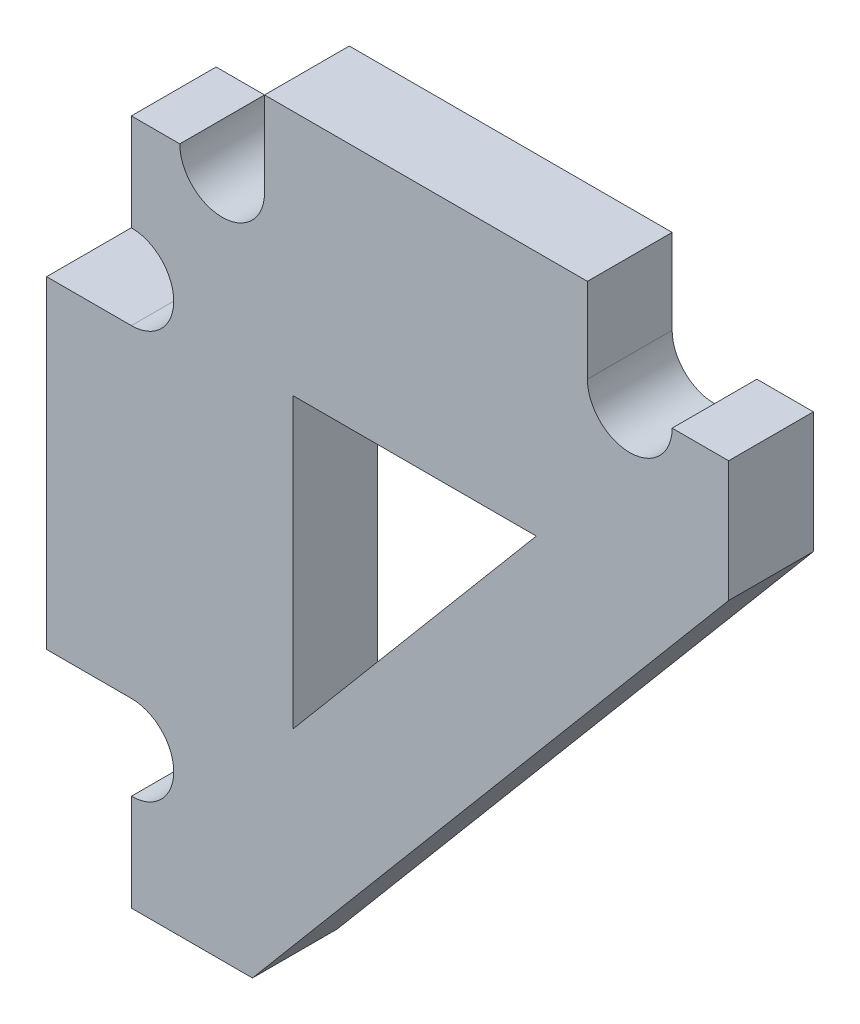
ISO-10303-21;
HEADER;
FILE_DESCRIPTION(('STEP AP214'),'2;1');
FILE_NAME('part.step','',(''),(''),'','','');
FILE_SCHEMA(('AUTOMOTIVE_DESIGN { 1 0 10303 214 1 1 1 1 }'));
ENDSEC;
DATA;
#1=APPLICATION_CONTEXT('core data for automotive mechanical design processes');
#2=APPLICATION_PROTOCOL_DEFINITION('international standard','automotive_design',2000,#1);
#3=PRODUCT_CONTEXT('',#1,'mechanical');
#4=PRODUCT('Part','Part','',(#3));
#5=PRODUCT_RELATED_PRODUCT_CATEGORY('part','',(#4));
#6=PRODUCT_DEFINITION_FORMATION('','',#4);
#7=PRODUCT_DEFINITION_CONTEXT('part definition',#1,'design');
#8=PRODUCT_DEFINITION('design','',#6,#7);
#9=PRODUCT_DEFINITION_SHAPE('','',#8);
#10=(LENGTH_UNIT() NAMED_UNIT(*) SI_UNIT(.MILLI.,.METRE.));
#11=(NAMED_UNIT(*) PLANE_ANGLE_UNIT() SI_UNIT($,.RADIAN.));
#12=(NAMED_UNIT(*) SI_UNIT($,.STERADIAN.) SOLID_ANGLE_UNIT());
#13=UNCERTAINTY_MEASURE_WITH_UNIT(LENGTH_MEASURE(1.E-05),#10,'distance_accuracy_value','');
#14=(GEOMETRIC_REPRESENTATION_CONTEXT(3) GLOBAL_UNCERTAINTY_ASSIGNED_CONTEXT((#13)) GLOBAL_UNIT_ASSIGNED_CONTEXT((#10,
#11,#12)) REPRESENTATION_CONTEXT('',''));
#15=CARTESIAN_POINT('',(0.,0.,0.));
#16=DIRECTION('',(0.,0.,1.));
#17=DIRECTION('',(1.,0.,0.));
#18=AXIS2_PLACEMENT_3D('',#15,#16,#17);
#19=CARTESIAN_POINT('',(0.,-4.,2.1));
#20=DIRECTION('',(0.,-1.,0.));
#21=DIRECTION('',(1.,0.,0.));
#22=AXIS2_PLACEMENT_3D('',#19,#20,#21);
#23=PLANE('',#22);
#24=DIRECTION('',(-1.,0.,0.));
#25=VECTOR('',#24,1.);
#26=CARTESIAN_POINT('',(0.,-4.,0.));
#27=LINE('',#26,#25);
#28=CARTESIAN_POINT('',(10.0336656405163,-4.,0.));
#29=VERTEX_POINT('',#28);
#30=CARTESIAN_POINT('',(4.,-4.,0.));
#31=VERTEX_POINT('',#30);
#32=EDGE_CURVE('E179',#29,#31,#27,.T.);
#33=ORIENTED_EDGE('',*,*,#32,.F.);
#34=DIRECTION('',(0.,0.,-1.));
#35=VECTOR('',#34,1.);
#36=CARTESIAN_POINT('',(10.0336656405163,-4.,2.1));
#37=LINE('',#36,#35);
#38=CARTESIAN_POINT('',(10.0336656405163,-4.,2.1));
#39=VERTEX_POINT('',#38);
#40=EDGE_CURVE('E11',#39,#29,#37,.T.);
#41=ORIENTED_EDGE('',*,*,#40,.F.);
#42=DIRECTION('',(-1.,0.,0.));
#43=VECTOR('',#42,1.);
#44=CARTESIAN_POINT('',(0.,-4.,2.1));
#45=LINE('',#44,#43);
#46=CARTESIAN_POINT('',(4.,-4.,2.1));
#47=VERTEX_POINT('',#46);
#48=EDGE_CURVE('E177',#39,#47,#45,.T.);
#49=ORIENTED_EDGE('',*,*,#48,.T.);
#50=DIRECTION('',(0.,0.,-1.));
#51=VECTOR('',#50,1.);
#52=CARTESIAN_POINT('',(4.,-4.,2.1));
#53=LINE('',#52,#51);
#54=EDGE_CURVE('E55',#47,#31,#53,.T.);
#55=ORIENTED_EDGE('',*,*,#54,.T.);
#56=EDGE_LOOP('',(#33,#41,#49,#55));
#57=FACE_BOUND('',#56,.T.);
#58=ADVANCED_FACE('F36',(#57),#23,.T.);
#59=CARTESIAN_POINT('',(7.83736566501967,-6.60577963194515,2.1));
#60=DIRECTION('',(-0.764627863081978,0.644472056026239,0.));
#61=DIRECTION('',(-0.644472056026239,-0.764627863081978,0.));
#62=AXIS2_PLACEMENT_3D('',#59,#60,#61);
#63=PLANE('',#62);
#64=DIRECTION('',(0.644472056026239,0.764627863081978,0.));
#65=VECTOR('',#64,1.);
#66=CARTESIAN_POINT('',(7.83736566501967,-6.60577963194515,0.));
#67=LINE('',#66,#65);
#68=CARTESIAN_POINT('',(4.,-11.1585863531549,0.));
#69=VERTEX_POINT('',#68);
#70=EDGE_CURVE('E239',#69,#29,#67,.T.);
#71=ORIENTED_EDGE('',*,*,#70,.F.);
#72=DIRECTION('',(0.,0.,-1.));
#73=VECTOR('',#72,1.);
#74=CARTESIAN_POINT('',(4.,-11.1585863531549,2.1));
#75=LINE('',#74,#73);
#76=CARTESIAN_POINT('',(4.,-11.1585863531549,2.1));
#77=VERTEX_POINT('',#76);
#78=EDGE_CURVE('E46',#77,#69,#75,.T.);
#79=ORIENTED_EDGE('',*,*,#78,.F.);
#80=DIRECTION('',(0.644472056026239,0.764627863081978,0.));
#81=VECTOR('',#80,1.);
#82=CARTESIAN_POINT('',(7.83736566501967,-6.60577963194515,2.1));
#83=LINE('',#82,#81);
#84=EDGE_CURVE('E186',#77,#39,#83,.T.);
#85=ORIENTED_EDGE('',*,*,#84,.T.);
#86=ORIENTED_EDGE('',*,*,#40,.T.);
#87=EDGE_LOOP('',(#71,#79,#85,#86));
#88=FACE_BOUND('',#87,.T.);
#89=ADVANCED_FACE('F190',(#88),#63,.T.);
#90=CARTESIAN_POINT('',(0.,-3.45,2.1));
#91=DIRECTION('',(0.,0.,-1.));
#92=DIRECTION('',(-1.,0.,0.));
#93=AXIS2_PLACEMENT_3D('',#90,#91,#92);
#94=CYLINDRICAL_SURFACE('',#93,1.05);
#95=CARTESIAN_POINT('',(0.,-3.45,0.));
#96=DIRECTION('',(0.,0.,1.));
#97=DIRECTION('',(1.,0.,0.));
#98=AXIS2_PLACEMENT_3D('',#95,#96,#97);
#99=CIRCLE('',#98,1.05);
#100=CARTESIAN_POINT('',(0.,-4.5,0.));
#101=VERTEX_POINT('',#100);
#102=CARTESIAN_POINT('',(0.,-2.4,0.));
#103=VERTEX_POINT('',#102);
#104=EDGE_CURVE('E196',#101,#103,#99,.T.);
#105=ORIENTED_EDGE('',*,*,#104,.F.);
#106=DIRECTION('',(0.,0.,-1.));
#107=VECTOR('',#106,1.);
#108=CARTESIAN_POINT('',(0.,-4.5,2.1));
#109=LINE('',#108,#107);
#110=CARTESIAN_POINT('',(0.,-4.5,2.1));
#111=VERTEX_POINT('',#110);
#112=EDGE_CURVE('E40',#111,#101,#109,.T.);
#113=ORIENTED_EDGE('',*,*,#112,.F.);
#114=CARTESIAN_POINT('',(0.,-3.45,2.1));
#115=DIRECTION('',(0.,0.,1.));
#116=DIRECTION('',(1.,0.,0.));
#117=AXIS2_PLACEMENT_3D('',#114,#115,#116);
#118=CIRCLE('',#117,1.05);
#119=CARTESIAN_POINT('',(0.,-2.4,2.1));
#120=VERTEX_POINT('',#119);
#121=EDGE_CURVE('E244',#111,#120,#118,.T.);
#122=ORIENTED_EDGE('',*,*,#121,.T.);
#123=DIRECTION('',(0.,0.,-1.));
#124=VECTOR('',#123,1.);
#125=CARTESIAN_POINT('',(0.,-2.4,2.1));
#126=LINE('',#125,#124);
#127=EDGE_CURVE('E192',#120,#103,#126,.T.);
#128=ORIENTED_EDGE('',*,*,#127,.T.);
#129=EDGE_LOOP('',(#105,#113,#122,#128));
#130=FACE_BOUND('',#129,.T.);
#131=ADVANCED_FACE('F38',(#130),#94,.F.);
#132=CARTESIAN_POINT('',(0.,-4.5,2.1));
#133=DIRECTION('',(0.,-1.,0.));
#134=DIRECTION('',(1.,0.,0.));
#135=AXIS2_PLACEMENT_3D('',#132,#133,#134);
#136=PLANE('',#135);
#137=DIRECTION('',(-1.,0.,0.));
#138=VECTOR('',#137,1.);
#139=CARTESIAN_POINT('',(0.,-4.5,0.));
#140=LINE('',#139,#138);
#141=CARTESIAN_POINT('',(-2.1,-4.5,0.));
#142=VERTEX_POINT('',#141);
#143=EDGE_CURVE('E199',#101,#142,#140,.T.);
#144=ORIENTED_EDGE('',*,*,#143,.T.);
#145=DIRECTION('',(0.,0.,-1.));
#146=VECTOR('',#145,1.);
#147=CARTESIAN_POINT('',(-2.1,-4.5,2.1));
#148=LINE('',#147,#146);
#149=CARTESIAN_POINT('',(-2.1,-4.5,2.1));
#150=VERTEX_POINT('',#149);
#151=EDGE_CURVE('E283',#150,#142,#148,.T.);
#152=ORIENTED_EDGE('',*,*,#151,.F.);
#153=DIRECTION('',(-1.,0.,0.));
#154=VECTOR('',#153,1.);
#155=CARTESIAN_POINT('',(0.,-4.5,2.1));
#156=LINE('',#155,#154);
#157=EDGE_CURVE('E292',#111,#150,#156,.T.);
#158=ORIENTED_EDGE('',*,*,#157,.F.);
#159=ORIENTED_EDGE('',*,*,#112,.T.);
#160=EDGE_LOOP('',(#144,#152,#158,#159));
#161=FACE_BOUND('',#160,.T.);
#162=ADVANCED_FACE('F291',(#161),#136,.F.);
#163=CARTESIAN_POINT('',(-2.1,0.,2.1));
#164=DIRECTION('',(1.,0.,0.));
#165=DIRECTION('',(0.,0.,-1.));
#166=AXIS2_PLACEMENT_3D('',#163,#164,#165);
#167=PLANE('',#166);
#168=DIRECTION('',(0.,-1.,0.));
#169=VECTOR('',#168,1.);
#170=CARTESIAN_POINT('',(-2.1,0.,0.));
#171=LINE('',#170,#169);
#172=CARTESIAN_POINT('',(-2.1,-12.5,0.));
#173=VERTEX_POINT('',#172);
#174=EDGE_CURVE('E201',#142,#173,#171,.T.);
#175=ORIENTED_EDGE('',*,*,#174,.T.);
#176=DIRECTION('',(0.,0.,-1.));
#177=VECTOR('',#176,1.);
#178=CARTESIAN_POINT('',(-2.1,-12.5,2.1));
#179=LINE('',#178,#177);
#180=CARTESIAN_POINT('',(-2.1,-12.5,2.1));
#181=VERTEX_POINT('',#180);
#182=EDGE_CURVE('E281',#181,#173,#179,.T.);
#183=ORIENTED_EDGE('',*,*,#182,.F.);
#184=DIRECTION('',(0.,-1.,0.));
#185=VECTOR('',#184,1.);
#186=CARTESIAN_POINT('',(-2.1,0.,2.1));
#187=LINE('',#186,#185);
#188=EDGE_CURVE('E379',#150,#181,#187,.T.);
#189=ORIENTED_EDGE('',*,*,#188,.F.);
#190=ORIENTED_EDGE('',*,*,#151,.T.);
#191=EDGE_LOOP('',(#175,#183,#189,#190));
#192=FACE_BOUND('',#191,.T.);
#193=ADVANCED_FACE('F378',(#192),#167,.F.);
#194=CARTESIAN_POINT('',(0.,-12.5,2.1));
#195=DIRECTION('',(0.,1.,0.));
#196=DIRECTION('',(0.,0.,1.));
#197=AXIS2_PLACEMENT_3D('',#194,#195,#196);
#198=PLANE('',#197);
#199=DIRECTION('',(1.,0.,0.));
#200=VECTOR('',#199,1.);
#201=CARTESIAN_POINT('',(0.,-12.5,0.));
#202=LINE('',#201,#200);
#203=CARTESIAN_POINT('',(0.,-12.5,0.));
#204=VERTEX_POINT('',#203);
#205=EDGE_CURVE('E203',#173,#204,#202,.T.);
#206=ORIENTED_EDGE('',*,*,#205,.T.);
#207=DIRECTION('',(0.,0.,-1.));
#208=VECTOR('',#207,1.);
#209=CARTESIAN_POINT('',(0.,-12.5,2.1));
#210=LINE('',#209,#208);
#211=CARTESIAN_POINT('',(0.,-12.5,2.1));
#212=VERTEX_POINT('',#211);
#213=EDGE_CURVE('E279',#212,#204,#210,.T.);
#214=ORIENTED_EDGE('',*,*,#213,.F.);
#215=DIRECTION('',(1.,0.,0.));
#216=VECTOR('',#215,1.);
#217=CARTESIAN_POINT('',(0.,-12.5,2.1));
#218=LINE('',#217,#216);
#219=EDGE_CURVE('E377',#181,#212,#218,.T.);
#220=ORIENTED_EDGE('',*,*,#219,.F.);
#221=ORIENTED_EDGE('',*,*,#182,.T.);
#222=EDGE_LOOP('',(#206,#214,#220,#221));
#223=FACE_BOUND('',#222,.T.);
#224=ADVANCED_FACE('F374',(#223),#198,.F.);
#225=CARTESIAN_POINT('',(0.,-13.55,2.1));
#226=DIRECTION('',(0.,0.,-1.));
#227=DIRECTION('',(-1.,0.,0.));
#228=AXIS2_PLACEMENT_3D('',#225,#226,#227);
#229=CYLINDRICAL_SURFACE('',#228,1.05);
#230=CARTESIAN_POINT('',(0.,-13.55,0.));
#231=DIRECTION('',(0.,0.,1.));
#232=DIRECTION('',(1.,0.,0.));
#233=AXIS2_PLACEMENT_3D('',#230,#231,#232);
#234=CIRCLE('',#233,1.05);
#235=CARTESIAN_POINT('',(0.,-14.6,0.));
#236=VERTEX_POINT('',#235);
#237=EDGE_CURVE('E206',#236,#204,#234,.T.);
#238=ORIENTED_EDGE('',*,*,#237,.F.);
#239=DIRECTION('',(0.,0.,-1.));
#240=VECTOR('',#239,1.);
#241=CARTESIAN_POINT('',(0.,-14.6,2.1));
#242=LINE('',#241,#240);
#243=CARTESIAN_POINT('',(0.,-14.6,2.1));
#244=VERTEX_POINT('',#243);
#245=EDGE_CURVE('E277',#244,#236,#242,.T.);
#246=ORIENTED_EDGE('',*,*,#245,.F.);
#247=CARTESIAN_POINT('',(0.,-13.55,2.1));
#248=DIRECTION('',(0.,0.,1.));
#249=DIRECTION('',(1.,0.,0.));
#250=AXIS2_PLACEMENT_3D('',#247,#248,#249);
#251=CIRCLE('',#250,1.05);
#252=EDGE_CURVE('E371',#244,#212,#251,.T.);
#253=ORIENTED_EDGE('',*,*,#252,.T.);
#254=ORIENTED_EDGE('',*,*,#213,.T.);
#255=EDGE_LOOP('',(#238,#246,#253,#254));
#256=FACE_BOUND('',#255,.T.);
#257=ADVANCED_FACE('F370',(#256),#229,.F.);
#258=CARTESIAN_POINT('',(0.,0.,2.1));
#259=DIRECTION('',(1.,0.,0.));
#260=DIRECTION('',(0.,1.,0.));
#261=AXIS2_PLACEMENT_3D('',#258,#259,#260);
#262=PLANE('',#261);
#263=DIRECTION('',(0.,-1.,0.));
#264=VECTOR('',#263,1.);
#265=CARTESIAN_POINT('',(0.,0.,0.));
#266=LINE('',#265,#264);
#267=CARTESIAN_POINT('',(0.,-17.,0.));
#268=VERTEX_POINT('',#267);
#269=EDGE_CURVE('E209',#236,#268,#266,.T.);
#270=ORIENTED_EDGE('',*,*,#269,.T.);
#271=DIRECTION('',(0.,0.,-1.));
#272=VECTOR('',#271,1.);
#273=CARTESIAN_POINT('',(0.,-17.,2.1));
#274=LINE('',#273,#272);
#275=CARTESIAN_POINT('',(0.,-17.,2.1));
#276=VERTEX_POINT('',#275);
#277=EDGE_CURVE('E274',#276,#268,#274,.T.);
#278=ORIENTED_EDGE('',*,*,#277,.F.);
#279=DIRECTION('',(0.,-1.,0.));
#280=VECTOR('',#279,1.);
#281=CARTESIAN_POINT('',(0.,0.,2.1));
#282=LINE('',#281,#280);
#283=EDGE_CURVE('E366',#244,#276,#282,.T.);
#284=ORIENTED_EDGE('',*,*,#283,.F.);
#285=ORIENTED_EDGE('',*,*,#245,.T.);
#286=EDGE_LOOP('',(#270,#278,#284,#285));
#287=FACE_BOUND('',#286,.T.);
#288=ADVANCED_FACE('F365',(#287),#262,.F.);
#289=CARTESIAN_POINT('',(0.,-17.,2.1));
#290=DIRECTION('',(0.,1.,0.));
#291=DIRECTION('',(-1.,0.,0.));
#292=AXIS2_PLACEMENT_3D('',#289,#290,#291);
#293=PLANE('',#292);
#294=DIRECTION('',(1.,0.,0.));
#295=VECTOR('',#294,1.);
#296=CARTESIAN_POINT('',(0.,-17.,0.));
#297=LINE('',#296,#295);
#298=CARTESIAN_POINT('',(3.,-17.,0.));
#299=VERTEX_POINT('',#298);
#300=EDGE_CURVE('E211',#268,#299,#297,.T.);
#301=ORIENTED_EDGE('',*,*,#300,.T.);
#302=DIRECTION('',(0.,0.,-1.));
#303=VECTOR('',#302,1.);
#304=CARTESIAN_POINT('',(3.,-17.,2.1));
#305=LINE('',#304,#303);
#306=CARTESIAN_POINT('',(3.,-17.,2.1));
#307=VERTEX_POINT('',#306);
#308=EDGE_CURVE('E271',#307,#299,#305,.T.);
#309=ORIENTED_EDGE('',*,*,#308,.F.);
#310=DIRECTION('',(1.,0.,0.));
#311=VECTOR('',#310,1.);
#312=CARTESIAN_POINT('',(0.,-17.,2.1));
#313=LINE('',#312,#311);
#314=EDGE_CURVE('E362',#276,#307,#313,.T.);
#315=ORIENTED_EDGE('',*,*,#314,.F.);
#316=ORIENTED_EDGE('',*,*,#277,.T.);
#317=EDGE_LOOP('',(#301,#309,#315,#316));
#318=FACE_BOUND('',#317,.T.);
#319=ADVANCED_FACE('F359',(#318),#293,.F.);
#320=CARTESIAN_POINT('',(10.1312492542656,-8.53919580002386,2.1));
#321=DIRECTION('',(-0.764627863081978,0.644472056026239,0.));
#322=DIRECTION('',(-0.644472056026239,-0.764627863081978,0.));
#323=AXIS2_PLACEMENT_3D('',#320,#321,#322);
#324=PLANE('',#323);
#325=DIRECTION('',(0.644472056026239,0.764627863081978,0.));
#326=VECTOR('',#325,1.);
#327=CARTESIAN_POINT('',(10.1312492542656,-8.53919580002386,0.));
#328=LINE('',#327,#326);
#329=CARTESIAN_POINT('',(14.8,-3.,0.));
#330=VERTEX_POINT('',#329);
#331=EDGE_CURVE('E213',#299,#330,#328,.T.);
#332=ORIENTED_EDGE('',*,*,#331,.T.);
#333=DIRECTION('',(0.,0.,-1.));
#334=VECTOR('',#333,1.);
#335=CARTESIAN_POINT('',(14.8,-3.,2.1));
#336=LINE('',#335,#334);
#337=CARTESIAN_POINT('',(14.8,-3.,2.1));
#338=VERTEX_POINT('',#337);
#339=EDGE_CURVE('E268',#338,#330,#336,.T.);
#340=ORIENTED_EDGE('',*,*,#339,.F.);
#341=DIRECTION('',(0.644472056026239,0.764627863081978,0.));
#342=VECTOR('',#341,1.);
#343=CARTESIAN_POINT('',(10.1312492542656,-8.53919580002386,2.1));
#344=LINE('',#343,#342);
#345=EDGE_CURVE('E353',#307,#338,#344,.T.);
#346=ORIENTED_EDGE('',*,*,#345,.F.);
#347=ORIENTED_EDGE('',*,*,#308,.T.);
#348=EDGE_LOOP('',(#332,#340,#346,#347));
#349=FACE_BOUND('',#348,.T.);
#350=ADVANCED_FACE('F352',(#349),#324,.F.);
#351=CARTESIAN_POINT('',(14.8,0.,2.1));
#352=DIRECTION('',(-1.,0.,0.));
#353=DIRECTION('',(0.,0.,1.));
#354=AXIS2_PLACEMENT_3D('',#351,#352,#353);
#355=PLANE('',#354);
#356=DIRECTION('',(0.,1.,0.));
#357=VECTOR('',#356,1.);
#358=CARTESIAN_POINT('',(14.8,0.,0.));
#359=LINE('',#358,#357);
#360=CARTESIAN_POINT('',(14.8,0.,0.));
#361=VERTEX_POINT('',#360);
#362=EDGE_CURVE('E215',#330,#361,#359,.T.);
#363=ORIENTED_EDGE('',*,*,#362,.T.);
#364=DIRECTION('',(0.,0.,-1.));
#365=VECTOR('',#364,1.);
#366=CARTESIAN_POINT('',(14.8,0.,2.1));
#367=LINE('',#366,#365);
#368=CARTESIAN_POINT('',(14.8,0.,2.1));
#369=VERTEX_POINT('',#368);
#370=EDGE_CURVE('E265',#369,#361,#367,.T.);
#371=ORIENTED_EDGE('',*,*,#370,.F.);
#372=DIRECTION('',(0.,1.,0.));
#373=VECTOR('',#372,1.);
#374=CARTESIAN_POINT('',(14.8,0.,2.1));
#375=LINE('',#374,#373);
#376=EDGE_CURVE('E348',#338,#369,#375,.T.);
#377=ORIENTED_EDGE('',*,*,#376,.F.);
#378=ORIENTED_EDGE('',*,*,#339,.T.);
#379=EDGE_LOOP('',(#363,#371,#377,#378));
#380=FACE_BOUND('',#379,.T.);
#381=ADVANCED_FACE('F347',(#380),#355,.F.);
#382=CARTESIAN_POINT('',(0.,0.,2.1));
#383=DIRECTION('',(0.,-1.,0.));
#384=DIRECTION('',(1.,0.,0.));
#385=AXIS2_PLACEMENT_3D('',#382,#383,#384);
#386=PLANE('',#385);
#387=DIRECTION('',(-1.,0.,0.));
#388=VECTOR('',#387,1.);
#389=CARTESIAN_POINT('',(0.,0.,0.));
#390=LINE('',#389,#388);
#391=CARTESIAN_POINT('',(13.4,0.,0.));
#392=VERTEX_POINT('',#391);
#393=EDGE_CURVE('E217',#361,#392,#390,.T.);
#394=ORIENTED_EDGE('',*,*,#393,.T.);
#395=DIRECTION('',(0.,0.,-1.));
#396=VECTOR('',#395,1.);
#397=CARTESIAN_POINT('',(13.4,0.,2.1));
#398=LINE('',#397,#396);
#399=CARTESIAN_POINT('',(13.4,0.,2.1));
#400=VERTEX_POINT('',#399);
#401=EDGE_CURVE('E263',#400,#392,#398,.T.);
#402=ORIENTED_EDGE('',*,*,#401,.F.);
#403=DIRECTION('',(-1.,0.,0.));
#404=VECTOR('',#403,1.);
#405=CARTESIAN_POINT('',(0.,0.,2.1));
#406=LINE('',#405,#404);
#407=EDGE_CURVE('E344',#369,#400,#406,.T.);
#408=ORIENTED_EDGE('',*,*,#407,.F.);
#409=ORIENTED_EDGE('',*,*,#370,.T.);
#410=EDGE_LOOP('',(#394,#402,#408,#409));
#411=FACE_BOUND('',#410,.T.);
#412=ADVANCED_FACE('F341',(#411),#386,.F.);
#413=CARTESIAN_POINT('',(12.35,0.,2.1));
#414=DIRECTION('',(0.,0.,-1.));
#415=DIRECTION('',(-1.,0.,0.));
#416=AXIS2_PLACEMENT_3D('',#413,#414,#415);
#417=CYLINDRICAL_SURFACE('',#416,1.05);
#418=CARTESIAN_POINT('',(12.35,0.,0.));
#419=DIRECTION('',(0.,0.,1.));
#420=DIRECTION('',(1.,0.,0.));
#421=AXIS2_PLACEMENT_3D('',#418,#419,#420);
#422=CIRCLE('',#421,1.05);
#423=CARTESIAN_POINT('',(11.3,0.,0.));
#424=VERTEX_POINT('',#423);
#425=EDGE_CURVE('E220',#424,#392,#422,.T.);
#426=ORIENTED_EDGE('',*,*,#425,.F.);
#427=DIRECTION('',(0.,0.,-1.));
#428=VECTOR('',#427,1.);
#429=CARTESIAN_POINT('',(11.3,0.,2.1));
#430=LINE('',#429,#428);
#431=CARTESIAN_POINT('',(11.3,0.,2.1));
#432=VERTEX_POINT('',#431);
#433=EDGE_CURVE('E261',#432,#424,#430,.T.);
#434=ORIENTED_EDGE('',*,*,#433,.F.);
#435=CARTESIAN_POINT('',(12.35,0.,2.1));
#436=DIRECTION('',(0.,0.,1.));
#437=DIRECTION('',(1.,0.,0.));
#438=AXIS2_PLACEMENT_3D('',#435,#436,#437);
#439=CIRCLE('',#438,1.05);
#440=EDGE_CURVE('E335',#432,#400,#439,.T.);
#441=ORIENTED_EDGE('',*,*,#440,.T.);
#442=ORIENTED_EDGE('',*,*,#401,.T.);
#443=EDGE_LOOP('',(#426,#434,#441,#442));
#444=FACE_BOUND('',#443,.T.);
#445=ADVANCED_FACE('F334',(#444),#417,.F.);
#446=CARTESIAN_POINT('',(11.3,0.,2.1));
#447=DIRECTION('',(-1.,0.,0.));
#448=DIRECTION('',(0.,0.,1.));
#449=AXIS2_PLACEMENT_3D('',#446,#447,#448);
#450=PLANE('',#449);
#451=DIRECTION('',(0.,1.,0.));
#452=VECTOR('',#451,1.);
#453=CARTESIAN_POINT('',(11.3,0.,0.));
#454=LINE('',#453,#452);
#455=CARTESIAN_POINT('',(11.3,2.1,0.));
#456=VERTEX_POINT('',#455);
#457=EDGE_CURVE('E223',#424,#456,#454,.T.);
#458=ORIENTED_EDGE('',*,*,#457,.T.);
#459=DIRECTION('',(0.,0.,-1.));
#460=VECTOR('',#459,1.);
#461=CARTESIAN_POINT('',(11.3,2.1,2.1));
#462=LINE('',#461,#460);
#463=CARTESIAN_POINT('',(11.3,2.1,2.1));
#464=VERTEX_POINT('',#463);
#465=EDGE_CURVE('E258',#464,#456,#462,.T.);
#466=ORIENTED_EDGE('',*,*,#465,.F.);
#467=DIRECTION('',(0.,1.,0.));
#468=VECTOR('',#467,1.);
#469=CARTESIAN_POINT('',(11.3,0.,2.1));
#470=LINE('',#469,#468);
#471=EDGE_CURVE('E330',#432,#464,#470,.T.);
#472=ORIENTED_EDGE('',*,*,#471,.F.);
#473=ORIENTED_EDGE('',*,*,#433,.T.);
#474=EDGE_LOOP('',(#458,#466,#472,#473));
#475=FACE_BOUND('',#474,.T.);
#476=ADVANCED_FACE('F329',(#475),#450,.F.);
#477=CARTESIAN_POINT('',(0.,2.1,2.1));
#478=DIRECTION('',(0.,-1.,0.));
#479=DIRECTION('',(1.,0.,0.));
#480=AXIS2_PLACEMENT_3D('',#477,#478,#479);
#481=PLANE('',#480);
#482=DIRECTION('',(-1.,0.,0.));
#483=VECTOR('',#482,1.);
#484=CARTESIAN_POINT('',(0.,2.1,0.));
#485=LINE('',#484,#483);
#486=CARTESIAN_POINT('',(3.3,2.1,0.));
#487=VERTEX_POINT('',#486);
#488=EDGE_CURVE('E225',#456,#487,#485,.T.);
#489=ORIENTED_EDGE('',*,*,#488,.T.);
#490=DIRECTION('',(0.,0.,-1.));
#491=VECTOR('',#490,1.);
#492=CARTESIAN_POINT('',(3.3,2.1,2.1));
#493=LINE('',#492,#491);
#494=CARTESIAN_POINT('',(3.3,2.1,2.1));
#495=VERTEX_POINT('',#494);
#496=EDGE_CURVE('E255',#495,#487,#493,.T.);
#497=ORIENTED_EDGE('',*,*,#496,.F.);
#498=DIRECTION('',(-1.,0.,0.));
#499=VECTOR('',#498,1.);
#500=CARTESIAN_POINT('',(0.,2.1,2.1));
#501=LINE('',#500,#499);
#502=EDGE_CURVE('E326',#464,#495,#501,.T.);
#503=ORIENTED_EDGE('',*,*,#502,.F.);
#504=ORIENTED_EDGE('',*,*,#465,.T.);
#505=EDGE_LOOP('',(#489,#497,#503,#504));
#506=FACE_BOUND('',#505,.T.);
#507=ADVANCED_FACE('F323',(#506),#481,.F.);
#508=CARTESIAN_POINT('',(3.3,0.,2.1));
#509=DIRECTION('',(1.,0.,0.));
#510=DIRECTION('',(0.,0.,-1.));
#511=AXIS2_PLACEMENT_3D('',#508,#509,#510);
#512=PLANE('',#511);
#513=DIRECTION('',(0.,-1.,0.));
#514=VECTOR('',#513,1.);
#515=CARTESIAN_POINT('',(3.3,0.,0.));
#516=LINE('',#515,#514);
#517=CARTESIAN_POINT('',(3.3,0.,0.));
#518=VERTEX_POINT('',#517);
#519=EDGE_CURVE('E227',#487,#518,#516,.T.);
#520=ORIENTED_EDGE('',*,*,#519,.T.);
#521=DIRECTION('',(0.,0.,-1.));
#522=VECTOR('',#521,1.);
#523=CARTESIAN_POINT('',(3.3,0.,2.1));
#524=LINE('',#523,#522);
#525=CARTESIAN_POINT('',(3.3,0.,2.1));
#526=VERTEX_POINT('',#525);
#527=EDGE_CURVE('E253',#526,#518,#524,.T.);
#528=ORIENTED_EDGE('',*,*,#527,.F.);
#529=DIRECTION('',(0.,-1.,0.));
#530=VECTOR('',#529,1.);
#531=CARTESIAN_POINT('',(3.3,0.,2.1));
#532=LINE('',#531,#530);
#533=EDGE_CURVE('E395',#495,#526,#532,.T.);
#534=ORIENTED_EDGE('',*,*,#533,.F.);
#535=ORIENTED_EDGE('',*,*,#496,.T.);
#536=EDGE_LOOP('',(#520,#528,#534,#535));
#537=FACE_BOUND('',#536,.T.);
#538=ADVANCED_FACE('F317',(#537),#512,.F.);
#539=CARTESIAN_POINT('',(2.25,0.,2.1));
#540=DIRECTION('',(0.,0.,-1.));
#541=DIRECTION('',(-1.,0.,0.));
#542=AXIS2_PLACEMENT_3D('',#539,#540,#541);
#543=CYLINDRICAL_SURFACE('',#542,1.05);
#544=CARTESIAN_POINT('',(2.25,0.,0.));
#545=DIRECTION('',(0.,0.,1.));
#546=DIRECTION('',(1.,0.,0.));
#547=AXIS2_PLACEMENT_3D('',#544,#545,#546);
#548=CIRCLE('',#547,1.05);
#549=CARTESIAN_POINT('',(1.2,0.,0.));
#550=VERTEX_POINT('',#549);
#551=EDGE_CURVE('E230',#550,#518,#548,.T.);
#552=ORIENTED_EDGE('',*,*,#551,.F.);
#553=DIRECTION('',(0.,0.,-1.));
#554=VECTOR('',#553,1.);
#555=CARTESIAN_POINT('',(1.2,0.,2.1));
#556=LINE('',#555,#554);
#557=CARTESIAN_POINT('',(1.2,0.,2.1));
#558=VERTEX_POINT('',#557);
#559=EDGE_CURVE('E251',#558,#550,#556,.T.);
#560=ORIENTED_EDGE('',*,*,#559,.F.);
#561=CARTESIAN_POINT('',(2.25,0.,2.1));
#562=DIRECTION('',(0.,0.,1.));
#563=DIRECTION('',(1.,0.,0.));
#564=AXIS2_PLACEMENT_3D('',#561,#562,#563);
#565=CIRCLE('',#564,1.05);
#566=EDGE_CURVE('E314',#558,#526,#565,.T.);
#567=ORIENTED_EDGE('',*,*,#566,.T.);
#568=ORIENTED_EDGE('',*,*,#527,.T.);
#569=EDGE_LOOP('',(#552,#560,#567,#568));
#570=FACE_BOUND('',#569,.T.);
#571=ADVANCED_FACE('F309',(#570),#543,.F.);
#572=CARTESIAN_POINT('',(0.,0.,2.1));
#573=DIRECTION('',(0.,-1.,0.));
#574=DIRECTION('',(1.,0.,0.));
#575=AXIS2_PLACEMENT_3D('',#572,#573,#574);
#576=PLANE('',#575);
#577=DIRECTION('',(-1.,0.,0.));
#578=VECTOR('',#577,1.);
#579=CARTESIAN_POINT('',(0.,0.,0.));
#580=LINE('',#579,#578);
#581=CARTESIAN_POINT('',(0.,0.,0.));
#582=VERTEX_POINT('',#581);
#583=EDGE_CURVE('E233',#550,#582,#580,.T.);
#584=ORIENTED_EDGE('',*,*,#583,.T.);
#585=DIRECTION('',(0.,0.,-1.));
#586=VECTOR('',#585,1.);
#587=CARTESIAN_POINT('',(0.,0.,2.1));
#588=LINE('',#587,#586);
#589=CARTESIAN_POINT('',(0.,0.,2.1));
#590=VERTEX_POINT('',#589);
#591=EDGE_CURVE('E248',#590,#582,#588,.T.);
#592=ORIENTED_EDGE('',*,*,#591,.F.);
#593=DIRECTION('',(-1.,0.,0.));
#594=VECTOR('',#593,1.);
#595=CARTESIAN_POINT('',(0.,0.,2.1));
#596=LINE('',#595,#594);
#597=EDGE_CURVE('E398',#558,#590,#596,.T.);
#598=ORIENTED_EDGE('',*,*,#597,.F.);
#599=ORIENTED_EDGE('',*,*,#559,.T.);
#600=EDGE_LOOP('',(#584,#592,#598,#599));
#601=FACE_BOUND('',#600,.T.);
#602=ADVANCED_FACE('F399',(#601),#576,.F.);
#603=CARTESIAN_POINT('',(0.,0.,2.1));
#604=DIRECTION('',(1.,0.,0.));
#605=DIRECTION('',(0.,1.,0.));
#606=AXIS2_PLACEMENT_3D('',#603,#604,#605);
#607=PLANE('',#606);
#608=DIRECTION('',(0.,-1.,0.));
#609=VECTOR('',#608,1.);
#610=CARTESIAN_POINT('',(0.,0.,0.));
#611=LINE('',#610,#609);
#612=EDGE_CURVE('E235',#582,#103,#611,.T.);
#613=ORIENTED_EDGE('',*,*,#612,.T.);
#614=ORIENTED_EDGE('',*,*,#127,.F.);
#615=DIRECTION('',(0.,-1.,0.));
#616=VECTOR('',#615,1.);
#617=CARTESIAN_POINT('',(0.,0.,2.1));
#618=LINE('',#617,#616);
#619=EDGE_CURVE('E188',#590,#120,#618,.T.);
#620=ORIENTED_EDGE('',*,*,#619,.F.);
#621=ORIENTED_EDGE('',*,*,#591,.T.);
#622=EDGE_LOOP('',(#613,#614,#620,#621));
#623=FACE_BOUND('',#622,.T.);
#624=ADVANCED_FACE('F302',(#623),#607,.F.);
#625=CARTESIAN_POINT('',(4.,0.,2.1));
#626=DIRECTION('',(1.,0.,0.));
#627=DIRECTION('',(0.,1.,0.));
#628=AXIS2_PLACEMENT_3D('',#625,#626,#627);
#629=PLANE('',#628);
#630=DIRECTION('',(0.,-1.,0.));
#631=VECTOR('',#630,1.);
#632=CARTESIAN_POINT('',(4.,0.,0.));
#633=LINE('',#632,#631);
#634=EDGE_CURVE('E241',#31,#69,#633,.T.);
#635=ORIENTED_EDGE('',*,*,#634,.F.);
#636=ORIENTED_EDGE('',*,*,#54,.F.);
#637=DIRECTION('',(0.,-1.,0.));
#638=VECTOR('',#637,1.);
#639=CARTESIAN_POINT('',(4.,0.,2.1));
#640=LINE('',#639,#638);
#641=EDGE_CURVE('E187',#47,#77,#640,.T.);
#642=ORIENTED_EDGE('',*,*,#641,.T.);
#643=ORIENTED_EDGE('',*,*,#78,.T.);
#644=EDGE_LOOP('',(#635,#636,#642,#643));
#645=FACE_BOUND('',#644,.T.);
#646=ADVANCED_FACE('F406',(#645),#629,.T.);
#647=CARTESIAN_POINT('',(0.,0.,2.1));
#648=DIRECTION('',(0.,0.,1.));
#649=DIRECTION('',(1.,0.,0.));
#650=AXIS2_PLACEMENT_3D('',#647,#648,#649);
#651=PLANE('',#650);
#652=ORIENTED_EDGE('',*,*,#121,.F.);
#653=ORIENTED_EDGE('',*,*,#157,.T.);
#654=ORIENTED_EDGE('',*,*,#188,.T.);
#655=ORIENTED_EDGE('',*,*,#219,.T.);
#656=ORIENTED_EDGE('',*,*,#252,.F.);
#657=ORIENTED_EDGE('',*,*,#283,.T.);
#658=ORIENTED_EDGE('',*,*,#314,.T.);
#659=ORIENTED_EDGE('',*,*,#345,.T.);
#660=ORIENTED_EDGE('',*,*,#376,.T.);
#661=ORIENTED_EDGE('',*,*,#407,.T.);
#662=ORIENTED_EDGE('',*,*,#440,.F.);
#663=ORIENTED_EDGE('',*,*,#471,.T.);
#664=ORIENTED_EDGE('',*,*,#502,.T.);
#665=ORIENTED_EDGE('',*,*,#533,.T.);
#666=ORIENTED_EDGE('',*,*,#566,.F.);
#667=ORIENTED_EDGE('',*,*,#597,.T.);
#668=ORIENTED_EDGE('',*,*,#619,.T.);
#669=EDGE_LOOP('',(#652,#653,#654,#655,#656,#657,#658,#659,#660,#661,#662,#663,#664,#665,#666,
#667,#668));
#670=FACE_BOUND('',#669,.T.);
#671=ORIENTED_EDGE('',*,*,#48,.F.);
#672=ORIENTED_EDGE('',*,*,#84,.F.);
#673=ORIENTED_EDGE('',*,*,#641,.F.);
#674=EDGE_LOOP('',(#671,#672,#673));
#675=FACE_BOUND('',#674,.T.);
#676=ADVANCED_FACE('F185',(#670,#675),#651,.T.);
#677=CARTESIAN_POINT('',(0.,0.,0.));
#678=DIRECTION('',(0.,0.,1.));
#679=DIRECTION('',(1.,0.,0.));
#680=AXIS2_PLACEMENT_3D('',#677,#678,#679);
#681=PLANE('',#680);
#682=ORIENTED_EDGE('',*,*,#104,.T.);
#683=ORIENTED_EDGE('',*,*,#612,.F.);
#684=ORIENTED_EDGE('',*,*,#583,.F.);
#685=ORIENTED_EDGE('',*,*,#551,.T.);
#686=ORIENTED_EDGE('',*,*,#519,.F.);
#687=ORIENTED_EDGE('',*,*,#488,.F.);
#688=ORIENTED_EDGE('',*,*,#457,.F.);
#689=ORIENTED_EDGE('',*,*,#425,.T.);
#690=ORIENTED_EDGE('',*,*,#393,.F.);
#691=ORIENTED_EDGE('',*,*,#362,.F.);
#692=ORIENTED_EDGE('',*,*,#331,.F.);
#693=ORIENTED_EDGE('',*,*,#300,.F.);
#694=ORIENTED_EDGE('',*,*,#269,.F.);
#695=ORIENTED_EDGE('',*,*,#237,.T.);
#696=ORIENTED_EDGE('',*,*,#205,.F.);
#697=ORIENTED_EDGE('',*,*,#174,.F.);
#698=ORIENTED_EDGE('',*,*,#143,.F.);
#699=EDGE_LOOP('',(#682,#683,#684,#685,#686,#687,#688,#689,#690,#691,#692,#693,#694,#695,#696,
#697,#698));
#700=FACE_BOUND('',#699,.T.);
#701=ORIENTED_EDGE('',*,*,#32,.T.);
#702=ORIENTED_EDGE('',*,*,#634,.T.);
#703=ORIENTED_EDGE('',*,*,#70,.T.);
#704=EDGE_LOOP('',(#701,#702,#703));
#705=FACE_BOUND('',#704,.T.);
#706=ADVANCED_FACE('F295',(#700,#705),#681,.F.);
#707=CLOSED_SHELL('',(#58,#89,#131,#162,#193,#224,#257,#288,#319,#350,#381,#412,#445,#476,#507,
#538,#571,#602,#624,#646,#676,#706));
#708=MANIFOLD_SOLID_BREP('B2',#707);
#709=ADVANCED_BREP_SHAPE_REPRESENTATION('',(#18,#708),#14);
#710=SHAPE_DEFINITION_REPRESENTATION(#9,#709);
ENDSEC;
END-ISO-10303-21;
